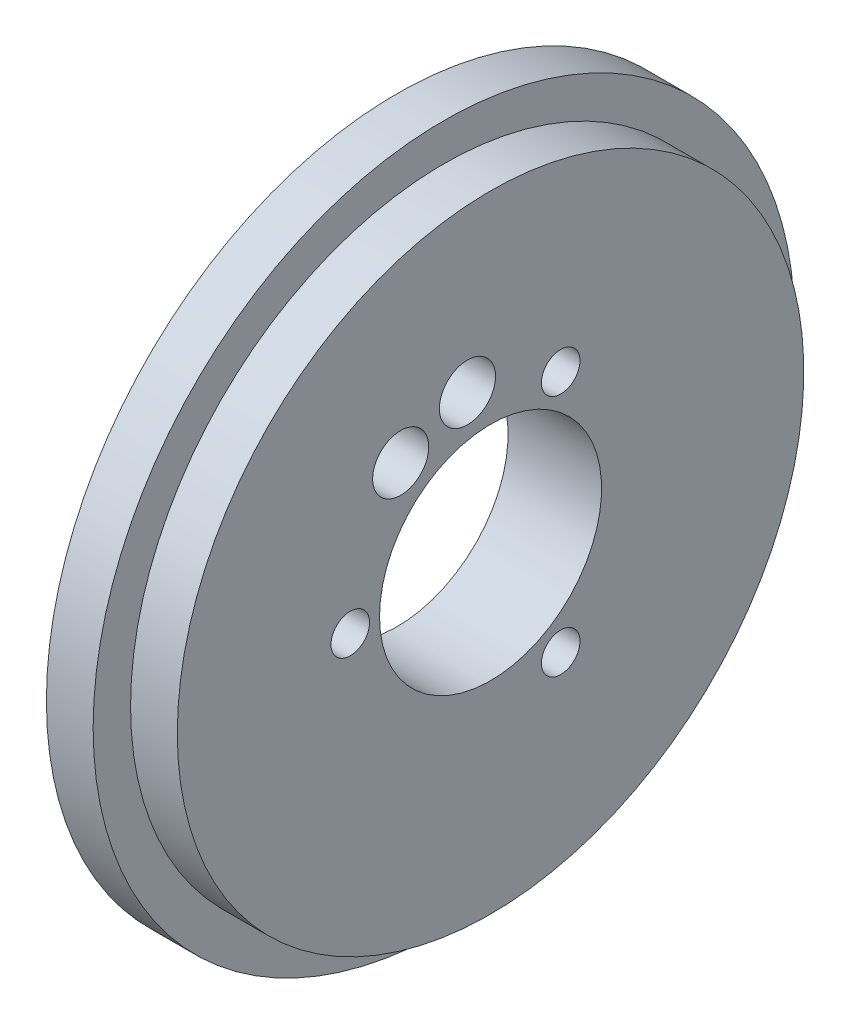
ISO-10303-21;
HEADER;
FILE_DESCRIPTION(('STEP AP214'),'2;1');
FILE_NAME('part.step','',(''),(''),'','','');
FILE_SCHEMA(('AUTOMOTIVE_DESIGN { 1 0 10303 214 1 1 1 1 }'));
ENDSEC;
DATA;
#1=APPLICATION_CONTEXT('core data for automotive mechanical design processes');
#2=APPLICATION_PROTOCOL_DEFINITION('international standard','automotive_design',2000,#1);
#3=PRODUCT_CONTEXT('',#1,'mechanical');
#4=PRODUCT('Part','Part','',(#3));
#5=PRODUCT_RELATED_PRODUCT_CATEGORY('part','',(#4));
#6=PRODUCT_DEFINITION_FORMATION('','',#4);
#7=PRODUCT_DEFINITION_CONTEXT('part definition',#1,'design');
#8=PRODUCT_DEFINITION('design','',#6,#7);
#9=PRODUCT_DEFINITION_SHAPE('','',#8);
#10=(LENGTH_UNIT() NAMED_UNIT(*) SI_UNIT(.MILLI.,.METRE.));
#11=(NAMED_UNIT(*) PLANE_ANGLE_UNIT() SI_UNIT($,.RADIAN.));
#12=(NAMED_UNIT(*) SI_UNIT($,.STERADIAN.) SOLID_ANGLE_UNIT());
#13=UNCERTAINTY_MEASURE_WITH_UNIT(LENGTH_MEASURE(1.E-05),#10,'distance_accuracy_value','');
#14=(GEOMETRIC_REPRESENTATION_CONTEXT(3) GLOBAL_UNCERTAINTY_ASSIGNED_CONTEXT((#13)) GLOBAL_UNIT_ASSIGNED_CONTEXT((#10,
#11,#12)) REPRESENTATION_CONTEXT('',''));
#15=CARTESIAN_POINT('',(0.,0.,0.));
#16=DIRECTION('',(0.,0.,1.));
#17=DIRECTION('',(1.,0.,0.));
#18=AXIS2_PLACEMENT_3D('',#15,#16,#17);
#19=CARTESIAN_POINT('',(135.7,30.,0.));
#20=DIRECTION('',(1.,0.,0.));
#21=DIRECTION('',(0.,0.,-1.));
#22=AXIS2_PLACEMENT_3D('',#19,#20,#21);
#23=PLANE('',#22);
#24=CARTESIAN_POINT('',(135.7,10.3923048454133,-6.00000000000001));
#25=DIRECTION('',(1.,0.,0.));
#26=DIRECTION('',(0.,0.,-1.));
#27=AXIS2_PLACEMENT_3D('',#24,#25,#26);
#28=CIRCLE('',#27,1.65);
#29=CARTESIAN_POINT('',(135.7,10.3923048454133,-7.65000000000001));
#30=VERTEX_POINT('',#29);
#31=EDGE_CURVE('E56',#30,#30,#28,.F.);
#32=ORIENTED_EDGE('',*,*,#31,.F.);
#33=EDGE_LOOP('',(#32));
#34=FACE_BOUND('',#33,.T.);
#35=CARTESIAN_POINT('',(135.7,-10.3923048454133,-6.));
#36=DIRECTION('',(1.,0.,0.));
#37=DIRECTION('',(0.,0.,-1.));
#38=AXIS2_PLACEMENT_3D('',#35,#36,#37);
#39=CIRCLE('',#38,1.65);
#40=CARTESIAN_POINT('',(135.7,-10.3923048454133,-7.65));
#41=VERTEX_POINT('',#40);
#42=EDGE_CURVE('E59',#41,#41,#39,.F.);
#43=ORIENTED_EDGE('',*,*,#42,.F.);
#44=EDGE_LOOP('',(#43));
#45=FACE_BOUND('',#44,.T.);
#46=CARTESIAN_POINT('',(135.7,0.,12.));
#47=DIRECTION('',(1.,0.,0.));
#48=DIRECTION('',(0.,0.,-1.));
#49=AXIS2_PLACEMENT_3D('',#46,#47,#48);
#50=CIRCLE('',#49,1.65);
#51=CARTESIAN_POINT('',(135.7,0.,10.35));
#52=VERTEX_POINT('',#51);
#53=EDGE_CURVE('E62',#52,#52,#50,.F.);
#54=ORIENTED_EDGE('',*,*,#53,.F.);
#55=EDGE_LOOP('',(#54));
#56=FACE_BOUND('',#55,.T.);
#57=CARTESIAN_POINT('',(135.7,10.4836474229945,7.68720604058077));
#58=DIRECTION('',(1.,0.,0.));
#59=DIRECTION('',(0.,0.,-1.));
#60=AXIS2_PLACEMENT_3D('',#57,#58,#59);
#61=CIRCLE('',#60,2.4);
#62=CARTESIAN_POINT('',(135.7,10.4836474229945,5.28720604058077));
#63=VERTEX_POINT('',#62);
#64=EDGE_CURVE('E65',#63,#63,#61,.F.);
#65=ORIENTED_EDGE('',*,*,#64,.F.);
#66=EDGE_LOOP('',(#65));
#67=FACE_BOUND('',#66,.T.);
#68=CARTESIAN_POINT('',(135.7,12.8487337040411,1.97738266469541));
#69=DIRECTION('',(1.,0.,0.));
#70=DIRECTION('',(0.,0.,-1.));
#71=AXIS2_PLACEMENT_3D('',#68,#69,#70);
#72=CIRCLE('',#71,2.4);
#73=CARTESIAN_POINT('',(135.7,12.8487337040411,-0.422617335304591));
#74=VERTEX_POINT('',#73);
#75=EDGE_CURVE('E68',#74,#74,#72,.F.);
#76=ORIENTED_EDGE('',*,*,#75,.F.);
#77=EDGE_LOOP('',(#76));
#78=FACE_BOUND('',#77,.T.);
#79=CARTESIAN_POINT('',(135.7,0.,0.));
#80=DIRECTION('',(-1.,0.,0.));
#81=DIRECTION('',(0.,0.,1.));
#82=AXIS2_PLACEMENT_3D('',#79,#80,#81);
#83=CIRCLE('',#82,9.5);
#84=CARTESIAN_POINT('',(135.7,0.,9.5));
#85=VERTEX_POINT('',#84);
#86=EDGE_CURVE('E10',#85,#85,#83,.T.);
#87=ORIENTED_EDGE('',*,*,#86,.F.);
#88=EDGE_LOOP('',(#87));
#89=FACE_BOUND('',#88,.T.);
#90=CARTESIAN_POINT('',(135.7,0.,0.));
#91=DIRECTION('',(-1.,0.,0.));
#92=DIRECTION('',(0.,0.,1.));
#93=AXIS2_PLACEMENT_3D('',#90,#91,#92);
#94=CIRCLE('',#93,30.);
#95=CARTESIAN_POINT('',(135.7,0.,30.));
#96=VERTEX_POINT('',#95);
#97=EDGE_CURVE('E53',#96,#96,#94,.T.);
#98=ORIENTED_EDGE('',*,*,#97,.T.);
#99=EDGE_LOOP('',(#98));
#100=FACE_BOUND('',#99,.T.);
#101=ADVANCED_FACE('F31',(#34,#45,#56,#67,#78,#89,#100),#23,.F.);
#102=CARTESIAN_POINT('',(-110.,0.,0.));
#103=DIRECTION('',(-1.,0.,0.));
#104=DIRECTION('',(0.,0.,1.));
#105=AXIS2_PLACEMENT_3D('',#102,#103,#104);
#106=CYLINDRICAL_SURFACE('',#105,9.5);
#107=CARTESIAN_POINT('',(143.7,0.,0.));
#108=DIRECTION('',(-1.,0.,0.));
#109=DIRECTION('',(0.,0.,1.));
#110=AXIS2_PLACEMENT_3D('',#107,#108,#109);
#111=CIRCLE('',#110,9.5);
#112=CARTESIAN_POINT('',(143.7,0.,9.5));
#113=VERTEX_POINT('',#112);
#114=EDGE_CURVE('E37',#113,#113,#111,.T.);
#115=ORIENTED_EDGE('',*,*,#114,.F.);
#116=EDGE_LOOP('',(#115));
#117=FACE_BOUND('',#116,.T.);
#118=ORIENTED_EDGE('',*,*,#86,.T.);
#119=EDGE_LOOP('',(#118));
#120=FACE_BOUND('',#119,.T.);
#121=ADVANCED_FACE('F94',(#117,#120),#106,.F.);
#122=CARTESIAN_POINT('',(143.7,9.5,0.));
#123=DIRECTION('',(-1.,0.,0.));
#124=DIRECTION('',(0.,0.,1.));
#125=AXIS2_PLACEMENT_3D('',#122,#123,#124);
#126=PLANE('',#125);
#127=CARTESIAN_POINT('',(143.7,10.3923048454133,-6.00000000000001));
#128=DIRECTION('',(1.,0.,0.));
#129=DIRECTION('',(0.,0.,-1.));
#130=AXIS2_PLACEMENT_3D('',#127,#128,#129);
#131=CIRCLE('',#130,1.65);
#132=CARTESIAN_POINT('',(143.7,10.3923048454133,-7.65000000000001));
#133=VERTEX_POINT('',#132);
#134=EDGE_CURVE('E75',#133,#133,#131,.T.);
#135=ORIENTED_EDGE('',*,*,#134,.F.);
#136=EDGE_LOOP('',(#135));
#137=FACE_BOUND('',#136,.T.);
#138=CARTESIAN_POINT('',(143.7,-10.3923048454133,-6.));
#139=DIRECTION('',(1.,0.,0.));
#140=DIRECTION('',(0.,0.,-1.));
#141=AXIS2_PLACEMENT_3D('',#138,#139,#140);
#142=CIRCLE('',#141,1.65);
#143=CARTESIAN_POINT('',(143.7,-10.3923048454133,-7.65));
#144=VERTEX_POINT('',#143);
#145=EDGE_CURVE('E78',#144,#144,#142,.T.);
#146=ORIENTED_EDGE('',*,*,#145,.F.);
#147=EDGE_LOOP('',(#146));
#148=FACE_BOUND('',#147,.T.);
#149=CARTESIAN_POINT('',(143.7,0.,12.));
#150=DIRECTION('',(1.,0.,0.));
#151=DIRECTION('',(0.,0.,-1.));
#152=AXIS2_PLACEMENT_3D('',#149,#150,#151);
#153=CIRCLE('',#152,1.65);
#154=CARTESIAN_POINT('',(143.7,0.,10.35));
#155=VERTEX_POINT('',#154);
#156=EDGE_CURVE('E81',#155,#155,#153,.T.);
#157=ORIENTED_EDGE('',*,*,#156,.F.);
#158=EDGE_LOOP('',(#157));
#159=FACE_BOUND('',#158,.T.);
#160=CARTESIAN_POINT('',(143.7,10.4836474229945,7.68720604058077));
#161=DIRECTION('',(1.,0.,0.));
#162=DIRECTION('',(0.,0.,-1.));
#163=AXIS2_PLACEMENT_3D('',#160,#161,#162);
#164=CIRCLE('',#163,2.4);
#165=CARTESIAN_POINT('',(143.7,10.4836474229945,5.28720604058077));
#166=VERTEX_POINT('',#165);
#167=EDGE_CURVE('E74',#166,#166,#164,.T.);
#168=ORIENTED_EDGE('',*,*,#167,.F.);
#169=EDGE_LOOP('',(#168));
#170=FACE_BOUND('',#169,.T.);
#171=CARTESIAN_POINT('',(143.7,12.8487337040411,1.97738266469541));
#172=DIRECTION('',(1.,0.,0.));
#173=DIRECTION('',(0.,0.,-1.));
#174=AXIS2_PLACEMENT_3D('',#171,#172,#173);
#175=CIRCLE('',#174,2.4);
#176=CARTESIAN_POINT('',(143.7,12.8487337040411,-0.422617335304591));
#177=VERTEX_POINT('',#176);
#178=EDGE_CURVE('E71',#177,#177,#175,.T.);
#179=ORIENTED_EDGE('',*,*,#178,.F.);
#180=EDGE_LOOP('',(#179));
#181=FACE_BOUND('',#180,.T.);
#182=CARTESIAN_POINT('',(143.7,0.,0.));
#183=DIRECTION('',(-1.,0.,0.));
#184=DIRECTION('',(0.,0.,1.));
#185=AXIS2_PLACEMENT_3D('',#182,#183,#184);
#186=CIRCLE('',#185,26.8);
#187=CARTESIAN_POINT('',(143.7,0.,26.8));
#188=VERTEX_POINT('',#187);
#189=EDGE_CURVE('E41',#188,#188,#186,.T.);
#190=ORIENTED_EDGE('',*,*,#189,.F.);
#191=EDGE_LOOP('',(#190));
#192=FACE_BOUND('',#191,.T.);
#193=ORIENTED_EDGE('',*,*,#114,.T.);
#194=EDGE_LOOP('',(#193));
#195=FACE_BOUND('',#194,.T.);
#196=ADVANCED_FACE('F90',(#137,#148,#159,#170,#181,#192,#195),#126,.F.);
#197=CARTESIAN_POINT('',(-110.,0.,0.));
#198=DIRECTION('',(-1.,0.,0.));
#199=DIRECTION('',(0.,0.,1.));
#200=AXIS2_PLACEMENT_3D('',#197,#198,#199);
#201=CYLINDRICAL_SURFACE('',#200,26.8);
#202=CARTESIAN_POINT('',(139.7,0.,0.));
#203=DIRECTION('',(-1.,0.,0.));
#204=DIRECTION('',(0.,0.,1.));
#205=AXIS2_PLACEMENT_3D('',#202,#203,#204);
#206=CIRCLE('',#205,26.8);
#207=CARTESIAN_POINT('',(139.7,0.,26.8));
#208=VERTEX_POINT('',#207);
#209=EDGE_CURVE('E45',#208,#208,#206,.T.);
#210=ORIENTED_EDGE('',*,*,#209,.F.);
#211=EDGE_LOOP('',(#210));
#212=FACE_BOUND('',#211,.T.);
#213=ORIENTED_EDGE('',*,*,#189,.T.);
#214=EDGE_LOOP('',(#213));
#215=FACE_BOUND('',#214,.T.);
#216=ADVANCED_FACE('F93',(#212,#215),#201,.T.);
#217=CARTESIAN_POINT('',(139.7,26.8,0.));
#218=DIRECTION('',(-1.,0.,0.));
#219=DIRECTION('',(0.,0.,1.));
#220=AXIS2_PLACEMENT_3D('',#217,#218,#219);
#221=PLANE('',#220);
#222=CARTESIAN_POINT('',(139.7,0.,0.));
#223=DIRECTION('',(-1.,0.,0.));
#224=DIRECTION('',(0.,0.,1.));
#225=AXIS2_PLACEMENT_3D('',#222,#223,#224);
#226=CIRCLE('',#225,30.);
#227=CARTESIAN_POINT('',(139.7,0.,30.));
#228=VERTEX_POINT('',#227);
#229=EDGE_CURVE('E50',#228,#228,#226,.T.);
#230=ORIENTED_EDGE('',*,*,#229,.F.);
#231=EDGE_LOOP('',(#230));
#232=FACE_BOUND('',#231,.T.);
#233=ORIENTED_EDGE('',*,*,#209,.T.);
#234=EDGE_LOOP('',(#233));
#235=FACE_BOUND('',#234,.T.);
#236=ADVANCED_FACE('F102',(#232,#235),#221,.F.);
#237=CARTESIAN_POINT('',(-110.,0.,0.));
#238=DIRECTION('',(-1.,0.,0.));
#239=DIRECTION('',(0.,0.,1.));
#240=AXIS2_PLACEMENT_3D('',#237,#238,#239);
#241=CYLINDRICAL_SURFACE('',#240,30.);
#242=ORIENTED_EDGE('',*,*,#97,.F.);
#243=EDGE_LOOP('',(#242));
#244=FACE_BOUND('',#243,.T.);
#245=ORIENTED_EDGE('',*,*,#229,.T.);
#246=EDGE_LOOP('',(#245));
#247=FACE_BOUND('',#246,.T.);
#248=ADVANCED_FACE('F108',(#244,#247),#241,.T.);
#249=CARTESIAN_POINT('',(143.7,12.8487337040411,1.97738266469541));
#250=DIRECTION('',(-1.,0.,0.));
#251=DIRECTION('',(0.,0.,1.));
#252=AXIS2_PLACEMENT_3D('',#249,#250,#251);
#253=CYLINDRICAL_SURFACE('',#252,2.4);
#254=ORIENTED_EDGE('',*,*,#178,.T.);
#255=EDGE_LOOP('',(#254));
#256=FACE_BOUND('',#255,.T.);
#257=ORIENTED_EDGE('',*,*,#75,.T.);
#258=EDGE_LOOP('',(#257));
#259=FACE_BOUND('',#258,.T.);
#260=ADVANCED_FACE('F133',(#256,#259),#253,.F.);
#261=CARTESIAN_POINT('',(143.7,10.4836474229945,7.68720604058077));
#262=DIRECTION('',(-1.,0.,0.));
#263=DIRECTION('',(0.,0.,1.));
#264=AXIS2_PLACEMENT_3D('',#261,#262,#263);
#265=CYLINDRICAL_SURFACE('',#264,2.4);
#266=ORIENTED_EDGE('',*,*,#167,.T.);
#267=EDGE_LOOP('',(#266));
#268=FACE_BOUND('',#267,.T.);
#269=ORIENTED_EDGE('',*,*,#64,.T.);
#270=EDGE_LOOP('',(#269));
#271=FACE_BOUND('',#270,.T.);
#272=ADVANCED_FACE('F87',(#268,#271),#265,.F.);
#273=CARTESIAN_POINT('',(143.7,0.,12.));
#274=DIRECTION('',(-1.,0.,0.));
#275=DIRECTION('',(0.,0.,1.));
#276=AXIS2_PLACEMENT_3D('',#273,#274,#275);
#277=CYLINDRICAL_SURFACE('',#276,1.65);
#278=ORIENTED_EDGE('',*,*,#156,.T.);
#279=EDGE_LOOP('',(#278));
#280=FACE_BOUND('',#279,.T.);
#281=ORIENTED_EDGE('',*,*,#53,.T.);
#282=EDGE_LOOP('',(#281));
#283=FACE_BOUND('',#282,.T.);
#284=ADVANCED_FACE('F150',(#280,#283),#277,.F.);
#285=CARTESIAN_POINT('',(143.7,-10.3923048454133,-6.));
#286=DIRECTION('',(-1.,0.,0.));
#287=DIRECTION('',(0.,0.,1.));
#288=AXIS2_PLACEMENT_3D('',#285,#286,#287);
#289=CYLINDRICAL_SURFACE('',#288,1.65);
#290=ORIENTED_EDGE('',*,*,#145,.T.);
#291=EDGE_LOOP('',(#290));
#292=FACE_BOUND('',#291,.T.);
#293=ORIENTED_EDGE('',*,*,#42,.T.);
#294=EDGE_LOOP('',(#293));
#295=FACE_BOUND('',#294,.T.);
#296=ADVANCED_FACE('F146',(#292,#295),#289,.F.);
#297=CARTESIAN_POINT('',(143.7,10.3923048454133,-6.00000000000001));
#298=DIRECTION('',(-1.,0.,0.));
#299=DIRECTION('',(0.,0.,1.));
#300=AXIS2_PLACEMENT_3D('',#297,#298,#299);
#301=CYLINDRICAL_SURFACE('',#300,1.65);
#302=ORIENTED_EDGE('',*,*,#134,.T.);
#303=EDGE_LOOP('',(#302));
#304=FACE_BOUND('',#303,.T.);
#305=ORIENTED_EDGE('',*,*,#31,.T.);
#306=EDGE_LOOP('',(#305));
#307=FACE_BOUND('',#306,.T.);
#308=ADVANCED_FACE('F143',(#304,#307),#301,.F.);
#309=CLOSED_SHELL('',(#101,#121,#196,#216,#236,#248,#260,#272,#284,#296,#308));
#310=MANIFOLD_SOLID_BREP('B2',#309);
#311=ADVANCED_BREP_SHAPE_REPRESENTATION('',(#18,#310),#14);
#312=SHAPE_DEFINITION_REPRESENTATION(#9,#311);
ENDSEC;
END-ISO-10303-21;
